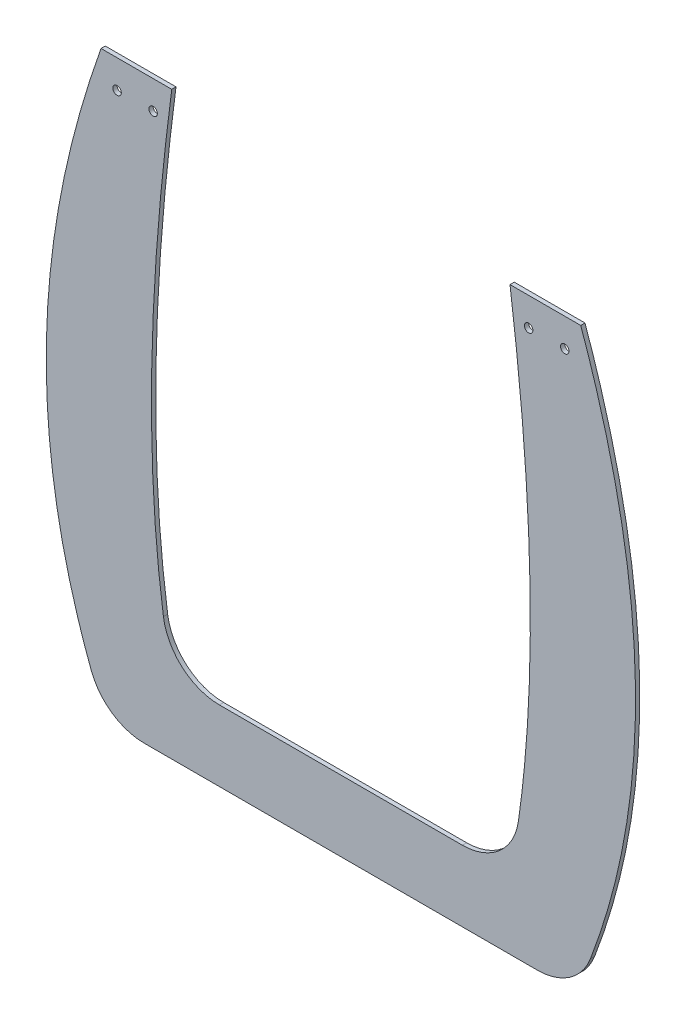
ISO-10303-21;
HEADER;
FILE_DESCRIPTION(('STEP AP214'),'2;1');
FILE_NAME('part.step','',(''),(''),'','','');
FILE_SCHEMA(('AUTOMOTIVE_DESIGN { 1 0 10303 214 1 1 1 1 }'));
ENDSEC;
DATA;
#1=APPLICATION_CONTEXT('core data for automotive mechanical design processes');
#2=APPLICATION_PROTOCOL_DEFINITION('international standard','automotive_design',2000,#1);
#3=PRODUCT_CONTEXT('',#1,'mechanical');
#4=PRODUCT('Part','Part','',(#3));
#5=PRODUCT_RELATED_PRODUCT_CATEGORY('part','',(#4));
#6=PRODUCT_DEFINITION_FORMATION('','',#4);
#7=PRODUCT_DEFINITION_CONTEXT('part definition',#1,'design');
#8=PRODUCT_DEFINITION('design','',#6,#7);
#9=PRODUCT_DEFINITION_SHAPE('','',#8);
#10=(LENGTH_UNIT() NAMED_UNIT(*) SI_UNIT(.MILLI.,.METRE.));
#11=(NAMED_UNIT(*) PLANE_ANGLE_UNIT() SI_UNIT($,.RADIAN.));
#12=(NAMED_UNIT(*) SI_UNIT($,.STERADIAN.) SOLID_ANGLE_UNIT());
#13=UNCERTAINTY_MEASURE_WITH_UNIT(LENGTH_MEASURE(1.E-05),#10,'distance_accuracy_value','');
#14=(GEOMETRIC_REPRESENTATION_CONTEXT(3) GLOBAL_UNCERTAINTY_ASSIGNED_CONTEXT((#13)) GLOBAL_UNIT_ASSIGNED_CONTEXT((#10,
#11,#12)) REPRESENTATION_CONTEXT('',''));
#15=CARTESIAN_POINT('',(0.,0.,0.));
#16=DIRECTION('',(0.,0.,1.));
#17=DIRECTION('',(1.,0.,0.));
#18=AXIS2_PLACEMENT_3D('',#15,#16,#17);
#19=CARTESIAN_POINT('',(2.86532380224582,-99.2964160775589,1.5));
#20=DIRECTION('',(0.,0.,1.));
#21=DIRECTION('',(1.,0.,0.));
#22=AXIS2_PLACEMENT_3D('',#19,#20,#21);
#23=PLANE('',#22);
#24=CARTESIAN_POINT('',(15.025,-10.,1.5));
#25=DIRECTION('',(0.,0.,1.));
#26=DIRECTION('',(1.,0.,0.));
#27=AXIS2_PLACEMENT_3D('',#24,#25,#26);
#28=CIRCLE('',#27,1.5);
#29=CARTESIAN_POINT('',(16.525,-10.,1.5));
#30=VERTEX_POINT('',#29);
#31=EDGE_CURVE('E353',#30,#30,#28,.T.);
#32=ORIENTED_EDGE('',*,*,#31,.F.);
#33=EDGE_LOOP('',(#32));
#34=FACE_BOUND('',#33,.T.);
#35=CARTESIAN_POINT('',(-143.185,-10.,1.5));
#36=DIRECTION('',(0.,0.,1.));
#37=DIRECTION('',(-1.,0.,0.));
#38=AXIS2_PLACEMENT_3D('',#35,#36,#37);
#39=CIRCLE('',#38,1.5);
#40=CARTESIAN_POINT('',(-144.685,-10.,1.5));
#41=VERTEX_POINT('',#40);
#42=EDGE_CURVE('E291',#41,#41,#39,.T.);
#43=ORIENTED_EDGE('',*,*,#42,.F.);
#44=EDGE_LOOP('',(#43));
#45=FACE_BOUND('',#44,.T.);
#46=CARTESIAN_POINT('',(-148.848445324632,0.,1.5));
#47=CARTESIAN_POINT('',(-188.472826490384,-111.601969694847,1.5));
#48=CARTESIAN_POINT('',(-146.979240623837,-205.,1.5));
#49=B_SPLINE_CURVE_WITH_KNOTS('',2,(#46,#47,#48),.UNSPECIFIED.,.F.,.F.,(3,3),(0.,
0.947972389530303),.UNSPECIFIED.);
#50=CARTESIAN_POINT('',(-148.848445324632,0.,1.5));
#51=VERTEX_POINT('',#50);
#52=CARTESIAN_POINT('',(-152.291305223362,-192.097798372561,1.5));
#53=VERTEX_POINT('',#52);
#54=EDGE_CURVE('E155',#51,#53,#49,.T.);
#55=ORIENTED_EDGE('',*,*,#54,.T.);
#56=CARTESIAN_POINT('',(-133.593143328073,-185.,1.5));
#57=DIRECTION('',(0.,0.,1.));
#58=DIRECTION('',(1.,0.,0.));
#59=AXIS2_PLACEMENT_3D('',#56,#57,#58);
#60=CIRCLE('',#59,20.);
#61=CARTESIAN_POINT('',(-133.593143328073,-205.,1.5));
#62=VERTEX_POINT('',#61);
#63=EDGE_CURVE('E47',#53,#62,#60,.T.);
#64=ORIENTED_EDGE('',*,*,#63,.T.);
#65=DIRECTION('',(1.,0.,0.));
#66=VECTOR('',#65,1.);
#67=CARTESIAN_POINT('',(-146.979240623837,-205.,1.5));
#68=LINE('',#67,#66);
#69=CARTESIAN_POINT('',(5.43314332807263,-205.,1.5));
#70=VERTEX_POINT('',#69);
#71=EDGE_CURVE('E157',#62,#70,#68,.T.);
#72=ORIENTED_EDGE('',*,*,#71,.T.);
#73=CARTESIAN_POINT('',(5.43314332807263,-185.,1.5));
#74=DIRECTION('',(0.,0.,1.));
#75=DIRECTION('',(1.,0.,0.));
#76=AXIS2_PLACEMENT_3D('',#73,#74,#75);
#77=CIRCLE('',#76,20.);
#78=CARTESIAN_POINT('',(24.1313052233624,-192.097798372561,1.5));
#79=VERTEX_POINT('',#78);
#80=EDGE_CURVE('E54',#70,#79,#77,.T.);
#81=ORIENTED_EDGE('',*,*,#80,.T.);
#82=CARTESIAN_POINT('',(18.8192406238369,-205.,1.5));
#83=CARTESIAN_POINT('',(60.3128264903845,-111.601969694847,1.5));
#84=CARTESIAN_POINT('',(20.6884453246323,0.,1.5));
#85=B_SPLINE_CURVE_WITH_KNOTS('',2,(#82,#83,#84),.UNSPECIFIED.,.F.,.F.,(3,3),(0.,
0.947972389530303),.UNSPECIFIED.);
#86=CARTESIAN_POINT('',(20.6884453246323,0.,1.5));
#87=VERTEX_POINT('',#86);
#88=EDGE_CURVE('E241',#79,#87,#85,.T.);
#89=ORIENTED_EDGE('',*,*,#88,.T.);
#90=DIRECTION('',(-1.,0.,0.));
#91=VECTOR('',#90,1.);
#92=CARTESIAN_POINT('',(-4.31155467536769,0.,1.5));
#93=LINE('',#92,#91);
#94=CARTESIAN_POINT('',(-4.31155467536769,0.,1.5));
#95=VERTEX_POINT('',#94);
#96=EDGE_CURVE('E271',#87,#95,#93,.T.);
#97=ORIENTED_EDGE('',*,*,#96,.T.);
#98=CARTESIAN_POINT('',(-4.31155467536769,0.,1.5));
#99=CARTESIAN_POINT('',(10.0422022798593,-108.592832155118,1.5));
#100=CARTESIAN_POINT('',(-4.31155467536769,-180.,1.5));
#101=B_SPLINE_CURVE_WITH_KNOTS('',2,(#98,#99,#100),.UNSPECIFIED.,.F.,.F.,(3,3),(0.,
0.806546206597984),.UNSPECIFIED.);
#102=CARTESIAN_POINT('',(-1.35976236998157,-162.878122708815,1.5));
#103=VERTEX_POINT('',#102);
#104=EDGE_CURVE('E194',#95,#103,#101,.T.);
#105=ORIENTED_EDGE('',*,*,#104,.T.);
#106=CARTESIAN_POINT('',(-21.1515892101953,-160.,1.5));
#107=DIRECTION('',(0.,0.,1.));
#108=DIRECTION('',(1.,0.,0.));
#109=AXIS2_PLACEMENT_3D('',#106,#107,#108);
#110=CIRCLE('',#109,20.);
#111=CARTESIAN_POINT('',(-21.1515892101953,-180.,1.5));
#112=VERTEX_POINT('',#111);
#113=EDGE_CURVE('E208',#103,#112,#110,.F.);
#114=ORIENTED_EDGE('',*,*,#113,.T.);
#115=DIRECTION('',(-1.,0.,0.));
#116=VECTOR('',#115,1.);
#117=CARTESIAN_POINT('',(-4.31155467536769,-180.,1.5));
#118=LINE('',#117,#116);
#119=CARTESIAN_POINT('',(-107.008410789805,-180.,1.5));
#120=VERTEX_POINT('',#119);
#121=EDGE_CURVE('E141',#112,#120,#118,.T.);
#122=ORIENTED_EDGE('',*,*,#121,.T.);
#123=CARTESIAN_POINT('',(-107.008410789805,-160.,1.5));
#124=DIRECTION('',(0.,0.,1.));
#125=DIRECTION('',(1.,0.,0.));
#126=AXIS2_PLACEMENT_3D('',#123,#124,#125);
#127=CIRCLE('',#126,20.);
#128=CARTESIAN_POINT('',(-126.800237630018,-162.878122708815,1.5));
#129=VERTEX_POINT('',#128);
#130=EDGE_CURVE('E137',#120,#129,#127,.F.);
#131=ORIENTED_EDGE('',*,*,#130,.T.);
#132=CARTESIAN_POINT('',(-123.848445324632,-180.,1.5));
#133=CARTESIAN_POINT('',(-138.202202279859,-108.592832155118,1.5));
#134=CARTESIAN_POINT('',(-123.848445324632,0.,1.5));
#135=B_SPLINE_CURVE_WITH_KNOTS('',2,(#132,#133,#134),.UNSPECIFIED.,.F.,.F.,(3,3),(0.,
0.806546206597984),.UNSPECIFIED.);
#136=CARTESIAN_POINT('',(-123.848445324632,0.,1.5));
#137=VERTEX_POINT('',#136);
#138=EDGE_CURVE('E129',#129,#137,#135,.T.);
#139=ORIENTED_EDGE('',*,*,#138,.T.);
#140=DIRECTION('',(-1.,0.,0.));
#141=VECTOR('',#140,1.);
#142=CARTESIAN_POINT('',(-123.848445324632,0.,1.5));
#143=LINE('',#142,#141);
#144=EDGE_CURVE('E133',#137,#51,#143,.T.);
#145=ORIENTED_EDGE('',*,*,#144,.T.);
#146=EDGE_LOOP('',(#55,#64,#72,#81,#89,#97,#105,#114,#122,#131,#139,#145));
#147=FACE_BOUND('',#146,.T.);
#148=CARTESIAN_POINT('',(2.285,-10.,1.5));
#149=DIRECTION('',(0.,0.,1.));
#150=DIRECTION('',(1.,0.,0.));
#151=AXIS2_PLACEMENT_3D('',#148,#149,#150);
#152=CIRCLE('',#151,1.5);
#153=CARTESIAN_POINT('',(3.785,-10.,1.5));
#154=VERTEX_POINT('',#153);
#155=EDGE_CURVE('E359',#154,#154,#152,.T.);
#156=ORIENTED_EDGE('',*,*,#155,.F.);
#157=EDGE_LOOP('',(#156));
#158=FACE_BOUND('',#157,.T.);
#159=CARTESIAN_POINT('',(-130.445,-10.,1.5));
#160=DIRECTION('',(0.,0.,1.));
#161=DIRECTION('',(-1.,0.,0.));
#162=AXIS2_PLACEMENT_3D('',#159,#160,#161);
#163=CIRCLE('',#162,1.5);
#164=CARTESIAN_POINT('',(-131.945,-10.,1.5));
#165=VERTEX_POINT('',#164);
#166=EDGE_CURVE('E344',#165,#165,#163,.T.);
#167=ORIENTED_EDGE('',*,*,#166,.F.);
#168=EDGE_LOOP('',(#167));
#169=FACE_BOUND('',#168,.T.);
#170=ADVANCED_FACE('F39',(#34,#45,#147,#158,#169),#23,.T.);
#171=CARTESIAN_POINT('',(2.86532380224582,-99.2964160775589,0.));
#172=DIRECTION('',(0.,0.,1.));
#173=DIRECTION('',(1.,0.,0.));
#174=AXIS2_PLACEMENT_3D('',#171,#172,#173);
#175=PLANE('',#174);
#176=DIRECTION('',(1.,0.,0.));
#177=VECTOR('',#176,1.);
#178=CARTESIAN_POINT('',(-146.979240623837,-205.,0.));
#179=LINE('',#178,#177);
#180=CARTESIAN_POINT('',(-133.593143328073,-205.,0.));
#181=VERTEX_POINT('',#180);
#182=CARTESIAN_POINT('',(5.43314332807263,-205.,0.));
#183=VERTEX_POINT('',#182);
#184=EDGE_CURVE('E247',#181,#183,#179,.T.);
#185=ORIENTED_EDGE('',*,*,#184,.F.);
#186=CARTESIAN_POINT('',(-133.593143328073,-185.,0.));
#187=DIRECTION('',(0.,0.,1.));
#188=DIRECTION('',(1.,0.,0.));
#189=AXIS2_PLACEMENT_3D('',#186,#187,#188);
#190=CIRCLE('',#189,20.);
#191=CARTESIAN_POINT('',(-152.291305223362,-192.097798372561,0.));
#192=VERTEX_POINT('',#191);
#193=EDGE_CURVE('E230',#181,#192,#190,.F.);
#194=ORIENTED_EDGE('',*,*,#193,.T.);
#195=CARTESIAN_POINT('',(-148.848445324632,0.,0.));
#196=CARTESIAN_POINT('',(-188.472826490384,-111.601969694847,0.));
#197=CARTESIAN_POINT('',(-146.979240623837,-205.,0.));
#198=B_SPLINE_CURVE_WITH_KNOTS('',2,(#195,#196,#197),.UNSPECIFIED.,.F.,.F.,(3,3),(0.,
0.947972389530303),.UNSPECIFIED.);
#199=CARTESIAN_POINT('',(-148.848445324632,0.,0.));
#200=VERTEX_POINT('',#199);
#201=EDGE_CURVE('E246',#200,#192,#198,.T.);
#202=ORIENTED_EDGE('',*,*,#201,.F.);
#203=DIRECTION('',(-1.,0.,0.));
#204=VECTOR('',#203,1.);
#205=CARTESIAN_POINT('',(-123.848445324632,0.,0.));
#206=LINE('',#205,#204);
#207=CARTESIAN_POINT('',(-123.848445324632,0.,0.));
#208=VERTEX_POINT('',#207);
#209=EDGE_CURVE('E248',#208,#200,#206,.T.);
#210=ORIENTED_EDGE('',*,*,#209,.F.);
#211=CARTESIAN_POINT('',(-123.848445324632,-180.,0.));
#212=CARTESIAN_POINT('',(-138.202202279859,-108.592832155118,0.));
#213=CARTESIAN_POINT('',(-123.848445324632,0.,0.));
#214=B_SPLINE_CURVE_WITH_KNOTS('',2,(#211,#212,#213),.UNSPECIFIED.,.F.,.F.,(3,3),(0.,
0.806546206597984),.UNSPECIFIED.);
#215=CARTESIAN_POINT('',(-126.800237630018,-162.878122708815,0.));
#216=VERTEX_POINT('',#215);
#217=EDGE_CURVE('E147',#216,#208,#214,.T.);
#218=ORIENTED_EDGE('',*,*,#217,.F.);
#219=CARTESIAN_POINT('',(-107.008410789805,-160.,0.));
#220=DIRECTION('',(0.,0.,1.));
#221=DIRECTION('',(1.,0.,0.));
#222=AXIS2_PLACEMENT_3D('',#219,#220,#221);
#223=CIRCLE('',#222,20.);
#224=CARTESIAN_POINT('',(-107.008410789805,-180.,0.));
#225=VERTEX_POINT('',#224);
#226=EDGE_CURVE('E215',#216,#225,#223,.T.);
#227=ORIENTED_EDGE('',*,*,#226,.T.);
#228=DIRECTION('',(-1.,0.,0.));
#229=VECTOR('',#228,1.);
#230=CARTESIAN_POINT('',(-4.31155467536769,-180.,0.));
#231=LINE('',#230,#229);
#232=CARTESIAN_POINT('',(-21.1515892101953,-180.,0.));
#233=VERTEX_POINT('',#232);
#234=EDGE_CURVE('E289',#233,#225,#231,.T.);
#235=ORIENTED_EDGE('',*,*,#234,.F.);
#236=CARTESIAN_POINT('',(-21.1515892101953,-160.,0.));
#237=DIRECTION('',(0.,0.,1.));
#238=DIRECTION('',(1.,0.,0.));
#239=AXIS2_PLACEMENT_3D('',#236,#237,#238);
#240=CIRCLE('',#239,20.);
#241=CARTESIAN_POINT('',(-1.35976236998157,-162.878122708815,0.));
#242=VERTEX_POINT('',#241);
#243=EDGE_CURVE('E214',#233,#242,#240,.T.);
#244=ORIENTED_EDGE('',*,*,#243,.T.);
#245=CARTESIAN_POINT('',(-4.31155467536769,0.,0.));
#246=CARTESIAN_POINT('',(10.0422022798593,-108.592832155118,0.));
#247=CARTESIAN_POINT('',(-4.31155467536769,-180.,0.));
#248=B_SPLINE_CURVE_WITH_KNOTS('',2,(#245,#246,#247),.UNSPECIFIED.,.F.,.F.,(3,3),(0.,
0.806546206597984),.UNSPECIFIED.);
#249=CARTESIAN_POINT('',(-4.31155467536769,0.,0.));
#250=VERTEX_POINT('',#249);
#251=EDGE_CURVE('E282',#250,#242,#248,.T.);
#252=ORIENTED_EDGE('',*,*,#251,.F.);
#253=DIRECTION('',(-1.,0.,0.));
#254=VECTOR('',#253,1.);
#255=CARTESIAN_POINT('',(-4.31155467536769,0.,0.));
#256=LINE('',#255,#254);
#257=CARTESIAN_POINT('',(20.6884453246323,0.,0.));
#258=VERTEX_POINT('',#257);
#259=EDGE_CURVE('E200',#258,#250,#256,.T.);
#260=ORIENTED_EDGE('',*,*,#259,.F.);
#261=CARTESIAN_POINT('',(18.8192406238369,-205.,0.));
#262=CARTESIAN_POINT('',(60.3128264903845,-111.601969694847,0.));
#263=CARTESIAN_POINT('',(20.6884453246323,0.,0.));
#264=B_SPLINE_CURVE_WITH_KNOTS('',2,(#261,#262,#263),.UNSPECIFIED.,.F.,.F.,(3,3),(0.,
0.947972389530303),.UNSPECIFIED.);
#265=CARTESIAN_POINT('',(24.1313052233624,-192.097798372561,0.));
#266=VERTEX_POINT('',#265);
#267=EDGE_CURVE('E250',#266,#258,#264,.T.);
#268=ORIENTED_EDGE('',*,*,#267,.F.);
#269=CARTESIAN_POINT('',(5.43314332807263,-185.,0.));
#270=DIRECTION('',(0.,0.,1.));
#271=DIRECTION('',(1.,0.,0.));
#272=AXIS2_PLACEMENT_3D('',#269,#270,#271);
#273=CIRCLE('',#272,20.);
#274=EDGE_CURVE('E228',#266,#183,#273,.F.);
#275=ORIENTED_EDGE('',*,*,#274,.T.);
#276=EDGE_LOOP('',(#185,#194,#202,#210,#218,#227,#235,#244,#252,#260,#268,#275));
#277=FACE_BOUND('',#276,.T.);
#278=CARTESIAN_POINT('',(-143.185,-10.,0.));
#279=DIRECTION('',(0.,0.,1.));
#280=DIRECTION('',(-1.,0.,0.));
#281=AXIS2_PLACEMENT_3D('',#278,#279,#280);
#282=CIRCLE('',#281,1.5);
#283=CARTESIAN_POINT('',(-144.685,-10.,0.));
#284=VERTEX_POINT('',#283);
#285=EDGE_CURVE('E201',#284,#284,#282,.T.);
#286=ORIENTED_EDGE('',*,*,#285,.T.);
#287=EDGE_LOOP('',(#286));
#288=FACE_BOUND('',#287,.T.);
#289=CARTESIAN_POINT('',(2.285,-10.,0.));
#290=DIRECTION('',(0.,0.,1.));
#291=DIRECTION('',(1.,0.,0.));
#292=AXIS2_PLACEMENT_3D('',#289,#290,#291);
#293=CIRCLE('',#292,1.5);
#294=CARTESIAN_POINT('',(3.785,-10.,0.));
#295=VERTEX_POINT('',#294);
#296=EDGE_CURVE('E356',#295,#295,#293,.T.);
#297=ORIENTED_EDGE('',*,*,#296,.T.);
#298=EDGE_LOOP('',(#297));
#299=FACE_BOUND('',#298,.T.);
#300=CARTESIAN_POINT('',(15.025,-10.,0.));
#301=DIRECTION('',(0.,0.,1.));
#302=DIRECTION('',(1.,0.,0.));
#303=AXIS2_PLACEMENT_3D('',#300,#301,#302);
#304=CIRCLE('',#303,1.5);
#305=CARTESIAN_POINT('',(16.525,-10.,0.));
#306=VERTEX_POINT('',#305);
#307=EDGE_CURVE('E350',#306,#306,#304,.T.);
#308=ORIENTED_EDGE('',*,*,#307,.T.);
#309=EDGE_LOOP('',(#308));
#310=FACE_BOUND('',#309,.T.);
#311=CARTESIAN_POINT('',(-130.445,-10.,0.));
#312=DIRECTION('',(0.,0.,1.));
#313=DIRECTION('',(-1.,0.,0.));
#314=AXIS2_PLACEMENT_3D('',#311,#312,#313);
#315=CIRCLE('',#314,1.5);
#316=CARTESIAN_POINT('',(-131.945,-10.,0.));
#317=VERTEX_POINT('',#316);
#318=EDGE_CURVE('E347',#317,#317,#315,.T.);
#319=ORIENTED_EDGE('',*,*,#318,.T.);
#320=EDGE_LOOP('',(#319));
#321=FACE_BOUND('',#320,.T.);
#322=ADVANCED_FACE('F190',(#277,#288,#299,#310,#321),#175,.F.);
#323=DIRECTION('',(0.,0.,-1.));
#324=VECTOR('',#323,1.);
#325=SURFACE_OF_LINEAR_EXTRUSION('',#101,#324);
#326=ORIENTED_EDGE('',*,*,#251,.T.);
#327=DIRECTION('',(0.,0.,-1.));
#328=VECTOR('',#327,1.);
#329=CARTESIAN_POINT('',(-1.35976236998157,-162.878122708815,0.));
#330=LINE('',#329,#328);
#331=EDGE_CURVE('E218',#242,#103,#330,.F.);
#332=ORIENTED_EDGE('',*,*,#331,.T.);
#333=ORIENTED_EDGE('',*,*,#104,.F.);
#334=DIRECTION('',(0.,0.,-1.));
#335=VECTOR('',#334,1.);
#336=CARTESIAN_POINT('',(-4.31155467536769,0.,1.5));
#337=LINE('',#336,#335);
#338=EDGE_CURVE('E267',#95,#250,#337,.T.);
#339=ORIENTED_EDGE('',*,*,#338,.T.);
#340=EDGE_LOOP('',(#326,#332,#333,#339));
#341=FACE_BOUND('',#340,.T.);
#342=ADVANCED_FACE('F185',(#341),#325,.F.);
#343=CARTESIAN_POINT('',(-4.31155467536769,-180.,1.5));
#344=DIRECTION('',(0.,-1.,0.));
#345=DIRECTION('',(0.,0.,-1.));
#346=AXIS2_PLACEMENT_3D('',#343,#344,#345);
#347=PLANE('',#346);
#348=ORIENTED_EDGE('',*,*,#234,.T.);
#349=DIRECTION('',(0.,0.,1.));
#350=VECTOR('',#349,1.);
#351=CARTESIAN_POINT('',(-107.008410789805,-180.,1.5));
#352=LINE('',#351,#350);
#353=EDGE_CURVE('E213',#225,#120,#352,.T.);
#354=ORIENTED_EDGE('',*,*,#353,.T.);
#355=ORIENTED_EDGE('',*,*,#121,.F.);
#356=DIRECTION('',(0.,0.,1.));
#357=VECTOR('',#356,1.);
#358=CARTESIAN_POINT('',(-21.1515892101953,-180.,0.));
#359=LINE('',#358,#357);
#360=EDGE_CURVE('E276',#112,#233,#359,.F.);
#361=ORIENTED_EDGE('',*,*,#360,.T.);
#362=EDGE_LOOP('',(#348,#354,#355,#361));
#363=FACE_BOUND('',#362,.T.);
#364=ADVANCED_FACE('F182',(#363),#347,.F.);
#365=DIRECTION('',(0.,0.,-1.));
#366=VECTOR('',#365,1.);
#367=SURFACE_OF_LINEAR_EXTRUSION('',#135,#366);
#368=ORIENTED_EDGE('',*,*,#138,.F.);
#369=DIRECTION('',(0.,0.,-1.));
#370=VECTOR('',#369,1.);
#371=CARTESIAN_POINT('',(-126.800237630018,-162.878122708815,1.5));
#372=LINE('',#371,#370);
#373=EDGE_CURVE('E150',#129,#216,#372,.T.);
#374=ORIENTED_EDGE('',*,*,#373,.T.);
#375=ORIENTED_EDGE('',*,*,#217,.T.);
#376=DIRECTION('',(0.,0.,-1.));
#377=VECTOR('',#376,1.);
#378=CARTESIAN_POINT('',(-123.848445324632,0.,1.5));
#379=LINE('',#378,#377);
#380=EDGE_CURVE('E144',#137,#208,#379,.T.);
#381=ORIENTED_EDGE('',*,*,#380,.F.);
#382=EDGE_LOOP('',(#368,#374,#375,#381));
#383=FACE_BOUND('',#382,.T.);
#384=ADVANCED_FACE('F145',(#383),#367,.F.);
#385=CARTESIAN_POINT('',(-123.848445324632,0.,1.5));
#386=DIRECTION('',(0.,-1.,0.));
#387=DIRECTION('',(0.,0.,-1.));
#388=AXIS2_PLACEMENT_3D('',#385,#386,#387);
#389=PLANE('',#388);
#390=ORIENTED_EDGE('',*,*,#209,.T.);
#391=DIRECTION('',(0.,0.,-1.));
#392=VECTOR('',#391,1.);
#393=CARTESIAN_POINT('',(-148.848445324632,0.,1.5));
#394=LINE('',#393,#392);
#395=EDGE_CURVE('E151',#51,#200,#394,.T.);
#396=ORIENTED_EDGE('',*,*,#395,.F.);
#397=ORIENTED_EDGE('',*,*,#144,.F.);
#398=ORIENTED_EDGE('',*,*,#380,.T.);
#399=EDGE_LOOP('',(#390,#396,#397,#398));
#400=FACE_BOUND('',#399,.T.);
#401=ADVANCED_FACE('F153',(#400),#389,.F.);
#402=DIRECTION('',(0.,0.,-1.));
#403=VECTOR('',#402,1.);
#404=SURFACE_OF_LINEAR_EXTRUSION('',#49,#403);
#405=ORIENTED_EDGE('',*,*,#201,.T.);
#406=DIRECTION('',(0.,0.,-1.));
#407=VECTOR('',#406,1.);
#408=CARTESIAN_POINT('',(-152.291305223363,-192.09779837256,0.));
#409=LINE('',#408,#407);
#410=EDGE_CURVE('E62',#192,#53,#409,.F.);
#411=ORIENTED_EDGE('',*,*,#410,.T.);
#412=ORIENTED_EDGE('',*,*,#54,.F.);
#413=ORIENTED_EDGE('',*,*,#395,.T.);
#414=EDGE_LOOP('',(#405,#411,#412,#413));
#415=FACE_BOUND('',#414,.T.);
#416=ADVANCED_FACE('F172',(#415),#404,.F.);
#417=CARTESIAN_POINT('',(-146.979240623837,-205.,1.5));
#418=DIRECTION('',(0.,1.,0.));
#419=DIRECTION('',(0.,0.,1.));
#420=AXIS2_PLACEMENT_3D('',#417,#418,#419);
#421=PLANE('',#420);
#422=ORIENTED_EDGE('',*,*,#71,.F.);
#423=DIRECTION('',(0.,0.,-1.));
#424=VECTOR('',#423,1.);
#425=CARTESIAN_POINT('',(-133.593143328073,-205.,1.5));
#426=LINE('',#425,#424);
#427=EDGE_CURVE('E225',#62,#181,#426,.T.);
#428=ORIENTED_EDGE('',*,*,#427,.T.);
#429=ORIENTED_EDGE('',*,*,#184,.T.);
#430=DIRECTION('',(0.,0.,-1.));
#431=VECTOR('',#430,1.);
#432=CARTESIAN_POINT('',(5.43314332807263,-205.,1.5));
#433=LINE('',#432,#431);
#434=EDGE_CURVE('E223',#183,#70,#433,.F.);
#435=ORIENTED_EDGE('',*,*,#434,.T.);
#436=EDGE_LOOP('',(#422,#428,#429,#435));
#437=FACE_BOUND('',#436,.T.);
#438=ADVANCED_FACE('F176',(#437),#421,.F.);
#439=DIRECTION('',(0.,0.,-1.));
#440=VECTOR('',#439,1.);
#441=SURFACE_OF_LINEAR_EXTRUSION('',#85,#440);
#442=ORIENTED_EDGE('',*,*,#88,.F.);
#443=DIRECTION('',(0.,0.,-1.));
#444=VECTOR('',#443,1.);
#445=CARTESIAN_POINT('',(24.1313052233628,-192.09779837256,1.5));
#446=LINE('',#445,#444);
#447=EDGE_CURVE('E11',#79,#266,#446,.T.);
#448=ORIENTED_EDGE('',*,*,#447,.T.);
#449=ORIENTED_EDGE('',*,*,#267,.T.);
#450=DIRECTION('',(0.,0.,-1.));
#451=VECTOR('',#450,1.);
#452=CARTESIAN_POINT('',(20.6884453246323,0.,1.5));
#453=LINE('',#452,#451);
#454=EDGE_CURVE('E270',#87,#258,#453,.T.);
#455=ORIENTED_EDGE('',*,*,#454,.F.);
#456=EDGE_LOOP('',(#442,#448,#449,#455));
#457=FACE_BOUND('',#456,.T.);
#458=ADVANCED_FACE('F310',(#457),#441,.F.);
#459=CARTESIAN_POINT('',(-4.31155467536769,0.,1.5));
#460=DIRECTION('',(0.,-1.,0.));
#461=DIRECTION('',(0.,0.,-1.));
#462=AXIS2_PLACEMENT_3D('',#459,#460,#461);
#463=PLANE('',#462);
#464=ORIENTED_EDGE('',*,*,#259,.T.);
#465=ORIENTED_EDGE('',*,*,#338,.F.);
#466=ORIENTED_EDGE('',*,*,#96,.F.);
#467=ORIENTED_EDGE('',*,*,#454,.T.);
#468=EDGE_LOOP('',(#464,#465,#466,#467));
#469=FACE_BOUND('',#468,.T.);
#470=ADVANCED_FACE('F313',(#469),#463,.F.);
#471=CARTESIAN_POINT('',(-143.185,-10.,1.5));
#472=DIRECTION('',(0.,0.,-1.));
#473=DIRECTION('',(-1.,0.,0.));
#474=AXIS2_PLACEMENT_3D('',#471,#472,#473);
#475=CYLINDRICAL_SURFACE('',#474,1.5);
#476=ORIENTED_EDGE('',*,*,#42,.T.);
#477=EDGE_LOOP('',(#476));
#478=FACE_BOUND('',#477,.T.);
#479=ORIENTED_EDGE('',*,*,#285,.F.);
#480=EDGE_LOOP('',(#479));
#481=FACE_BOUND('',#480,.T.);
#482=ADVANCED_FACE('F317',(#478,#481),#475,.F.);
#483=CARTESIAN_POINT('',(2.285,-10.,1.5));
#484=DIRECTION('',(0.,0.,-1.));
#485=DIRECTION('',(-1.,0.,0.));
#486=AXIS2_PLACEMENT_3D('',#483,#484,#485);
#487=CYLINDRICAL_SURFACE('',#486,1.5);
#488=ORIENTED_EDGE('',*,*,#155,.T.);
#489=EDGE_LOOP('',(#488));
#490=FACE_BOUND('',#489,.T.);
#491=ORIENTED_EDGE('',*,*,#296,.F.);
#492=EDGE_LOOP('',(#491));
#493=FACE_BOUND('',#492,.T.);
#494=ADVANCED_FACE('F326',(#490,#493),#487,.F.);
#495=CARTESIAN_POINT('',(15.025,-10.,1.5));
#496=DIRECTION('',(0.,0.,-1.));
#497=DIRECTION('',(-1.,0.,0.));
#498=AXIS2_PLACEMENT_3D('',#495,#496,#497);
#499=CYLINDRICAL_SURFACE('',#498,1.5);
#500=ORIENTED_EDGE('',*,*,#31,.T.);
#501=EDGE_LOOP('',(#500));
#502=FACE_BOUND('',#501,.T.);
#503=ORIENTED_EDGE('',*,*,#307,.F.);
#504=EDGE_LOOP('',(#503));
#505=FACE_BOUND('',#504,.T.);
#506=ADVANCED_FACE('F330',(#502,#505),#499,.F.);
#507=CARTESIAN_POINT('',(-130.445,-10.,1.5));
#508=DIRECTION('',(0.,0.,-1.));
#509=DIRECTION('',(-1.,0.,0.));
#510=AXIS2_PLACEMENT_3D('',#507,#508,#509);
#511=CYLINDRICAL_SURFACE('',#510,1.5);
#512=ORIENTED_EDGE('',*,*,#166,.T.);
#513=EDGE_LOOP('',(#512));
#514=FACE_BOUND('',#513,.T.);
#515=ORIENTED_EDGE('',*,*,#318,.F.);
#516=EDGE_LOOP('',(#515));
#517=FACE_BOUND('',#516,.T.);
#518=ADVANCED_FACE('F334',(#514,#517),#511,.F.);
#519=CARTESIAN_POINT('',(-107.008410789805,-160.,0.75));
#520=DIRECTION('',(0.,0.,-1.));
#521=DIRECTION('',(-1.,0.,0.));
#522=AXIS2_PLACEMENT_3D('',#519,#520,#521);
#523=CYLINDRICAL_SURFACE('',#522,20.);
#524=ORIENTED_EDGE('',*,*,#130,.F.);
#525=ORIENTED_EDGE('',*,*,#353,.F.);
#526=ORIENTED_EDGE('',*,*,#226,.F.);
#527=ORIENTED_EDGE('',*,*,#373,.F.);
#528=EDGE_LOOP('',(#524,#525,#526,#527));
#529=FACE_BOUND('',#528,.T.);
#530=ADVANCED_FACE('F192',(#529),#523,.F.);
#531=CARTESIAN_POINT('',(-21.1515892101953,-160.,0.75));
#532=DIRECTION('',(0.,0.,-1.));
#533=DIRECTION('',(-1.,0.,0.));
#534=AXIS2_PLACEMENT_3D('',#531,#532,#533);
#535=CYLINDRICAL_SURFACE('',#534,20.);
#536=ORIENTED_EDGE('',*,*,#113,.F.);
#537=ORIENTED_EDGE('',*,*,#331,.F.);
#538=ORIENTED_EDGE('',*,*,#243,.F.);
#539=ORIENTED_EDGE('',*,*,#360,.F.);
#540=EDGE_LOOP('',(#536,#537,#538,#539));
#541=FACE_BOUND('',#540,.T.);
#542=ADVANCED_FACE('F286',(#541),#535,.F.);
#543=CARTESIAN_POINT('',(-133.593143328073,-185.,0.75));
#544=DIRECTION('',(0.,0.,-1.));
#545=DIRECTION('',(-1.,0.,0.));
#546=AXIS2_PLACEMENT_3D('',#543,#544,#545);
#547=CYLINDRICAL_SURFACE('',#546,20.);
#548=ORIENTED_EDGE('',*,*,#63,.F.);
#549=ORIENTED_EDGE('',*,*,#410,.F.);
#550=ORIENTED_EDGE('',*,*,#193,.F.);
#551=ORIENTED_EDGE('',*,*,#427,.F.);
#552=EDGE_LOOP('',(#548,#549,#550,#551));
#553=FACE_BOUND('',#552,.T.);
#554=ADVANCED_FACE('F242',(#553),#547,.T.);
#555=CARTESIAN_POINT('',(5.43314332807263,-185.,0.75));
#556=DIRECTION('',(0.,0.,-1.));
#557=DIRECTION('',(-1.,0.,0.));
#558=AXIS2_PLACEMENT_3D('',#555,#556,#557);
#559=CYLINDRICAL_SURFACE('',#558,20.);
#560=ORIENTED_EDGE('',*,*,#80,.F.);
#561=ORIENTED_EDGE('',*,*,#434,.F.);
#562=ORIENTED_EDGE('',*,*,#274,.F.);
#563=ORIENTED_EDGE('',*,*,#447,.F.);
#564=EDGE_LOOP('',(#560,#561,#562,#563));
#565=FACE_BOUND('',#564,.T.);
#566=ADVANCED_FACE('F41',(#565),#559,.T.);
#567=CLOSED_SHELL('',(#170,#322,#342,#364,#384,#401,#416,#438,#458,#470,#482,#494,#506,#518,
#530,#542,#554,#566));
#568=MANIFOLD_SOLID_BREP('B2',#567);
#569=ADVANCED_BREP_SHAPE_REPRESENTATION('',(#18,#568),#14);
#570=SHAPE_DEFINITION_REPRESENTATION(#9,#569);
ENDSEC;
END-ISO-10303-21;
